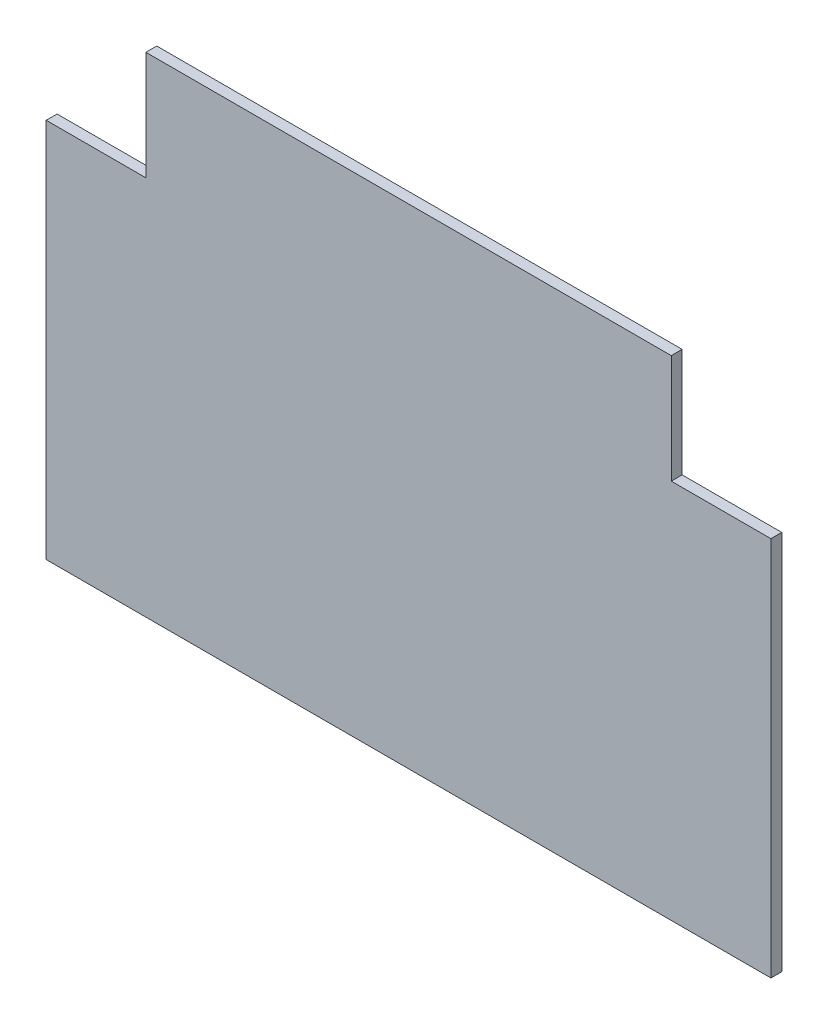
ISO-10303-21;
HEADER;
FILE_DESCRIPTION(('STEP AP214'),'2;1');
FILE_NAME('part.step','',(''),(''),'','','');
FILE_SCHEMA(('AUTOMOTIVE_DESIGN { 1 0 10303 214 1 1 1 1 }'));
ENDSEC;
DATA;
#1=APPLICATION_CONTEXT('core data for automotive mechanical design processes');
#2=APPLICATION_PROTOCOL_DEFINITION('international standard','automotive_design',2000,#1);
#3=PRODUCT_CONTEXT('',#1,'mechanical');
#4=PRODUCT('Part','Part','',(#3));
#5=PRODUCT_RELATED_PRODUCT_CATEGORY('part','',(#4));
#6=PRODUCT_DEFINITION_FORMATION('','',#4);
#7=PRODUCT_DEFINITION_CONTEXT('part definition',#1,'design');
#8=PRODUCT_DEFINITION('design','',#6,#7);
#9=PRODUCT_DEFINITION_SHAPE('','',#8);
#10=(LENGTH_UNIT() NAMED_UNIT(*) SI_UNIT(.MILLI.,.METRE.));
#11=(NAMED_UNIT(*) PLANE_ANGLE_UNIT() SI_UNIT($,.RADIAN.));
#12=(NAMED_UNIT(*) SI_UNIT($,.STERADIAN.) SOLID_ANGLE_UNIT());
#13=UNCERTAINTY_MEASURE_WITH_UNIT(LENGTH_MEASURE(1.E-05),#10,'distance_accuracy_value','');
#14=(GEOMETRIC_REPRESENTATION_CONTEXT(3) GLOBAL_UNCERTAINTY_ASSIGNED_CONTEXT((#13)) GLOBAL_UNIT_ASSIGNED_CONTEXT((#10,
#11,#12)) REPRESENTATION_CONTEXT('',''));
#15=CARTESIAN_POINT('',(0.,0.,0.));
#16=DIRECTION('',(0.,0.,1.));
#17=DIRECTION('',(1.,0.,0.));
#18=AXIS2_PLACEMENT_3D('',#15,#16,#17);
#19=CARTESIAN_POINT('',(-110.868616619322,260.666802075719,6.));
#20=DIRECTION('',(1.,0.,0.));
#21=DIRECTION('',(0.,1.,0.));
#22=AXIS2_PLACEMENT_3D('',#19,#20,#21);
#23=PLANE('',#22);
#24=DIRECTION('',(0.,-1.,0.));
#25=VECTOR('',#24,1.);
#26=CARTESIAN_POINT('',(-110.868616619322,260.666802075719,6.));
#27=LINE('',#26,#25);
#28=CARTESIAN_POINT('',(-110.868616619322,200.666802075719,6.));
#29=VERTEX_POINT('',#28);
#30=CARTESIAN_POINT('',(-110.868616619322,-9.33319792428152,6.));
#31=VERTEX_POINT('',#30);
#32=EDGE_CURVE('E140',#29,#31,#27,.T.);
#33=ORIENTED_EDGE('',*,*,#32,.F.);
#34=DIRECTION('',(0.,0.,-1.));
#35=VECTOR('',#34,1.);
#36=CARTESIAN_POINT('',(-110.868616619322,200.666802075719,40.));
#37=LINE('',#36,#35);
#38=CARTESIAN_POINT('',(-110.868616619322,200.666802075719,0.));
#39=VERTEX_POINT('',#38);
#40=EDGE_CURVE('E113',#29,#39,#37,.T.);
#41=ORIENTED_EDGE('',*,*,#40,.T.);
#42=DIRECTION('',(0.,-1.,0.));
#43=VECTOR('',#42,1.);
#44=CARTESIAN_POINT('',(-110.868616619322,260.666802075719,0.));
#45=LINE('',#44,#43);
#46=CARTESIAN_POINT('',(-110.868616619322,-9.33319792428152,0.));
#47=VERTEX_POINT('',#46);
#48=EDGE_CURVE('E139',#39,#47,#45,.T.);
#49=ORIENTED_EDGE('',*,*,#48,.T.);
#50=DIRECTION('',(0.,0.,-1.));
#51=VECTOR('',#50,1.);
#52=CARTESIAN_POINT('',(-110.868616619322,-9.33319792428152,6.));
#53=LINE('',#52,#51);
#54=EDGE_CURVE('E11',#31,#47,#53,.T.);
#55=ORIENTED_EDGE('',*,*,#54,.F.);
#56=EDGE_LOOP('',(#33,#41,#49,#55));
#57=FACE_BOUND('',#56,.T.);
#58=ADVANCED_FACE('F33',(#57),#23,.F.);
#59=CARTESIAN_POINT('',(-110.868616619322,-9.33319792428152,6.));
#60=DIRECTION('',(0.,1.,0.));
#61=DIRECTION('',(0.,0.,1.));
#62=AXIS2_PLACEMENT_3D('',#59,#60,#61);
#63=PLANE('',#62);
#64=DIRECTION('',(1.,0.,0.));
#65=VECTOR('',#64,1.);
#66=CARTESIAN_POINT('',(-110.868616619322,-9.33319792428152,0.));
#67=LINE('',#66,#65);
#68=CARTESIAN_POINT('',(289.131383380678,-9.33319792428152,0.));
#69=VERTEX_POINT('',#68);
#70=EDGE_CURVE('E151',#47,#69,#67,.T.);
#71=ORIENTED_EDGE('',*,*,#70,.T.);
#72=DIRECTION('',(0.,0.,-1.));
#73=VECTOR('',#72,1.);
#74=CARTESIAN_POINT('',(289.131383380678,-9.33319792428152,6.));
#75=LINE('',#74,#73);
#76=CARTESIAN_POINT('',(289.131383380678,-9.33319792428152,6.));
#77=VERTEX_POINT('',#76);
#78=EDGE_CURVE('E40',#77,#69,#75,.T.);
#79=ORIENTED_EDGE('',*,*,#78,.F.);
#80=DIRECTION('',(1.,0.,0.));
#81=VECTOR('',#80,1.);
#82=CARTESIAN_POINT('',(-110.868616619322,-9.33319792428152,6.));
#83=LINE('',#82,#81);
#84=EDGE_CURVE('E142',#31,#77,#83,.T.);
#85=ORIENTED_EDGE('',*,*,#84,.F.);
#86=ORIENTED_EDGE('',*,*,#54,.T.);
#87=EDGE_LOOP('',(#71,#79,#85,#86));
#88=FACE_BOUND('',#87,.T.);
#89=ADVANCED_FACE('F166',(#88),#63,.F.);
#90=CARTESIAN_POINT('',(289.131383380678,260.666802075719,6.));
#91=DIRECTION('',(-1.,0.,0.));
#92=DIRECTION('',(0.,-1.,0.));
#93=AXIS2_PLACEMENT_3D('',#90,#91,#92);
#94=PLANE('',#93);
#95=DIRECTION('',(0.,1.,0.));
#96=VECTOR('',#95,1.);
#97=CARTESIAN_POINT('',(289.131383380678,260.666802075719,0.));
#98=LINE('',#97,#96);
#99=CARTESIAN_POINT('',(289.131383380678,200.666802075719,0.));
#100=VERTEX_POINT('',#99);
#101=EDGE_CURVE('E153',#69,#100,#98,.T.);
#102=ORIENTED_EDGE('',*,*,#101,.T.);
#103=DIRECTION('',(0.,0.,-1.));
#104=VECTOR('',#103,1.);
#105=CARTESIAN_POINT('',(289.131383380678,200.666802075719,40.));
#106=LINE('',#105,#104);
#107=CARTESIAN_POINT('',(289.131383380678,200.666802075719,6.));
#108=VERTEX_POINT('',#107);
#109=EDGE_CURVE('E47',#108,#100,#106,.T.);
#110=ORIENTED_EDGE('',*,*,#109,.F.);
#111=DIRECTION('',(0.,1.,0.));
#112=VECTOR('',#111,1.);
#113=CARTESIAN_POINT('',(289.131383380678,260.666802075719,6.));
#114=LINE('',#113,#112);
#115=EDGE_CURVE('E144',#77,#108,#114,.T.);
#116=ORIENTED_EDGE('',*,*,#115,.F.);
#117=ORIENTED_EDGE('',*,*,#78,.T.);
#118=EDGE_LOOP('',(#102,#110,#116,#117));
#119=FACE_BOUND('',#118,.T.);
#120=ADVANCED_FACE('F159',(#119),#94,.F.);
#121=CARTESIAN_POINT('',(-110.868616619322,260.666802075719,6.));
#122=DIRECTION('',(0.,-1.,0.));
#123=DIRECTION('',(0.,0.,-1.));
#124=AXIS2_PLACEMENT_3D('',#121,#122,#123);
#125=PLANE('',#124);
#126=DIRECTION('',(-1.,0.,0.));
#127=VECTOR('',#126,1.);
#128=CARTESIAN_POINT('',(-110.868616619322,260.666802075719,6.));
#129=LINE('',#128,#127);
#130=CARTESIAN_POINT('',(234.131383380678,260.666802075719,6.));
#131=VERTEX_POINT('',#130);
#132=CARTESIAN_POINT('',(-55.8686166193218,260.666802075719,6.));
#133=VERTEX_POINT('',#132);
#134=EDGE_CURVE('E147',#131,#133,#129,.T.);
#135=ORIENTED_EDGE('',*,*,#134,.F.);
#136=DIRECTION('',(0.,0.,-1.));
#137=VECTOR('',#136,1.);
#138=CARTESIAN_POINT('',(234.131383380678,260.666802075719,40.));
#139=LINE('',#138,#137);
#140=CARTESIAN_POINT('',(234.131383380678,260.666802075719,0.));
#141=VERTEX_POINT('',#140);
#142=EDGE_CURVE('E106',#131,#141,#139,.T.);
#143=ORIENTED_EDGE('',*,*,#142,.T.);
#144=DIRECTION('',(-1.,0.,0.));
#145=VECTOR('',#144,1.);
#146=CARTESIAN_POINT('',(-110.868616619322,260.666802075719,0.));
#147=LINE('',#146,#145);
#148=CARTESIAN_POINT('',(-55.8686166193218,260.666802075719,0.));
#149=VERTEX_POINT('',#148);
#150=EDGE_CURVE('E118',#141,#149,#147,.T.);
#151=ORIENTED_EDGE('',*,*,#150,.T.);
#152=DIRECTION('',(0.,0.,-1.));
#153=VECTOR('',#152,1.);
#154=CARTESIAN_POINT('',(-55.8686166193218,260.666802075719,40.));
#155=LINE('',#154,#153);
#156=EDGE_CURVE('E55',#133,#149,#155,.T.);
#157=ORIENTED_EDGE('',*,*,#156,.F.);
#158=EDGE_LOOP('',(#135,#143,#151,#157));
#159=FACE_BOUND('',#158,.T.);
#160=ADVANCED_FACE('F179',(#159),#125,.F.);
#161=CARTESIAN_POINT('',(0.,0.,6.));
#162=DIRECTION('',(0.,0.,1.));
#163=DIRECTION('',(1.,0.,0.));
#164=AXIS2_PLACEMENT_3D('',#161,#162,#163);
#165=PLANE('',#164);
#166=DIRECTION('',(0.,-1.,0.));
#167=VECTOR('',#166,1.);
#168=CARTESIAN_POINT('',(234.131383380678,0.,6.));
#169=LINE('',#168,#167);
#170=CARTESIAN_POINT('',(234.131383380678,200.666802075719,6.));
#171=VERTEX_POINT('',#170);
#172=EDGE_CURVE('E104',#131,#171,#169,.T.);
#173=ORIENTED_EDGE('',*,*,#172,.F.);
#174=ORIENTED_EDGE('',*,*,#134,.T.);
#175=DIRECTION('',(0.,1.,0.));
#176=VECTOR('',#175,1.);
#177=CARTESIAN_POINT('',(-55.8686166193217,0.,6.));
#178=LINE('',#177,#176);
#179=CARTESIAN_POINT('',(-55.8686166193218,200.666802075719,6.));
#180=VERTEX_POINT('',#179);
#181=EDGE_CURVE('E122',#180,#133,#178,.T.);
#182=ORIENTED_EDGE('',*,*,#181,.F.);
#183=DIRECTION('',(1.,0.,0.));
#184=VECTOR('',#183,1.);
#185=CARTESIAN_POINT('',(0.,200.666802075719,6.));
#186=LINE('',#185,#184);
#187=EDGE_CURVE('E134',#29,#180,#186,.T.);
#188=ORIENTED_EDGE('',*,*,#187,.F.);
#189=ORIENTED_EDGE('',*,*,#32,.T.);
#190=ORIENTED_EDGE('',*,*,#84,.T.);
#191=ORIENTED_EDGE('',*,*,#115,.T.);
#192=DIRECTION('',(1.,0.,0.));
#193=VECTOR('',#192,1.);
#194=CARTESIAN_POINT('',(0.,200.666802075719,6.));
#195=LINE('',#194,#193);
#196=EDGE_CURVE('E136',#171,#108,#195,.T.);
#197=ORIENTED_EDGE('',*,*,#196,.F.);
#198=EDGE_LOOP('',(#173,#174,#182,#188,#189,#190,#191,#197));
#199=FACE_BOUND('',#198,.T.);
#200=ADVANCED_FACE('F175',(#199),#165,.T.);
#201=CARTESIAN_POINT('',(0.,0.,0.));
#202=DIRECTION('',(0.,0.,1.));
#203=DIRECTION('',(1.,0.,0.));
#204=AXIS2_PLACEMENT_3D('',#201,#202,#203);
#205=PLANE('',#204);
#206=ORIENTED_EDGE('',*,*,#150,.F.);
#207=DIRECTION('',(0.,1.,0.));
#208=VECTOR('',#207,1.);
#209=CARTESIAN_POINT('',(234.131383380678,200.666802075719,0.));
#210=LINE('',#209,#208);
#211=CARTESIAN_POINT('',(234.131383380678,200.666802075719,0.));
#212=VERTEX_POINT('',#211);
#213=EDGE_CURVE('E101',#212,#141,#210,.T.);
#214=ORIENTED_EDGE('',*,*,#213,.F.);
#215=DIRECTION('',(-1.,0.,0.));
#216=VECTOR('',#215,1.);
#217=CARTESIAN_POINT('',(289.131383380678,200.666802075719,0.));
#218=LINE('',#217,#216);
#219=EDGE_CURVE('E108',#100,#212,#218,.T.);
#220=ORIENTED_EDGE('',*,*,#219,.F.);
#221=ORIENTED_EDGE('',*,*,#101,.F.);
#222=ORIENTED_EDGE('',*,*,#70,.F.);
#223=ORIENTED_EDGE('',*,*,#48,.F.);
#224=DIRECTION('',(-1.,0.,0.));
#225=VECTOR('',#224,1.);
#226=CARTESIAN_POINT('',(-110.868616619322,200.666802075719,0.));
#227=LINE('',#226,#225);
#228=CARTESIAN_POINT('',(-55.8686166193218,200.666802075719,0.));
#229=VERTEX_POINT('',#228);
#230=EDGE_CURVE('E126',#229,#39,#227,.T.);
#231=ORIENTED_EDGE('',*,*,#230,.F.);
#232=DIRECTION('',(0.,-1.,0.));
#233=VECTOR('',#232,1.);
#234=CARTESIAN_POINT('',(-55.8686166193218,200.666802075719,0.));
#235=LINE('',#234,#233);
#236=EDGE_CURVE('E124',#149,#229,#235,.T.);
#237=ORIENTED_EDGE('',*,*,#236,.F.);
#238=EDGE_LOOP('',(#206,#214,#220,#221,#222,#223,#231,#237));
#239=FACE_BOUND('',#238,.T.);
#240=ADVANCED_FACE('F116',(#239),#205,.F.);
#241=CARTESIAN_POINT('',(-110.868616619322,200.666802075719,40.));
#242=DIRECTION('',(0.,-1.,0.));
#243=DIRECTION('',(0.,0.,-1.));
#244=AXIS2_PLACEMENT_3D('',#241,#242,#243);
#245=PLANE('',#244);
#246=ORIENTED_EDGE('',*,*,#187,.T.);
#247=DIRECTION('',(0.,0.,-1.));
#248=VECTOR('',#247,1.);
#249=CARTESIAN_POINT('',(-55.8686166193218,200.666802075719,40.));
#250=LINE('',#249,#248);
#251=EDGE_CURVE('E130',#180,#229,#250,.T.);
#252=ORIENTED_EDGE('',*,*,#251,.T.);
#253=ORIENTED_EDGE('',*,*,#230,.T.);
#254=ORIENTED_EDGE('',*,*,#40,.F.);
#255=EDGE_LOOP('',(#246,#252,#253,#254));
#256=FACE_BOUND('',#255,.T.);
#257=ADVANCED_FACE('F171',(#256),#245,.F.);
#258=CARTESIAN_POINT('',(-55.8686166193218,200.666802075719,40.));
#259=DIRECTION('',(1.,0.,0.));
#260=DIRECTION('',(0.,1.,0.));
#261=AXIS2_PLACEMENT_3D('',#258,#259,#260);
#262=PLANE('',#261);
#263=ORIENTED_EDGE('',*,*,#181,.T.);
#264=ORIENTED_EDGE('',*,*,#156,.T.);
#265=ORIENTED_EDGE('',*,*,#236,.T.);
#266=ORIENTED_EDGE('',*,*,#251,.F.);
#267=EDGE_LOOP('',(#263,#264,#265,#266));
#268=FACE_BOUND('',#267,.T.);
#269=ADVANCED_FACE('F177',(#268),#262,.F.);
#270=CARTESIAN_POINT('',(234.131383380678,200.666802075719,40.));
#271=DIRECTION('',(-1.,0.,0.));
#272=DIRECTION('',(0.,0.,1.));
#273=AXIS2_PLACEMENT_3D('',#270,#271,#272);
#274=PLANE('',#273);
#275=ORIENTED_EDGE('',*,*,#172,.T.);
#276=DIRECTION('',(0.,0.,-1.));
#277=VECTOR('',#276,1.);
#278=CARTESIAN_POINT('',(234.131383380678,200.666802075719,40.));
#279=LINE('',#278,#277);
#280=EDGE_CURVE('E98',#171,#212,#279,.T.);
#281=ORIENTED_EDGE('',*,*,#280,.T.);
#282=ORIENTED_EDGE('',*,*,#213,.T.);
#283=ORIENTED_EDGE('',*,*,#142,.F.);
#284=EDGE_LOOP('',(#275,#281,#282,#283));
#285=FACE_BOUND('',#284,.T.);
#286=ADVANCED_FACE('F99',(#285),#274,.F.);
#287=CARTESIAN_POINT('',(289.131383380678,200.666802075719,40.));
#288=DIRECTION('',(0.,-1.,0.));
#289=DIRECTION('',(0.,0.,-1.));
#290=AXIS2_PLACEMENT_3D('',#287,#288,#289);
#291=PLANE('',#290);
#292=ORIENTED_EDGE('',*,*,#196,.T.);
#293=ORIENTED_EDGE('',*,*,#109,.T.);
#294=ORIENTED_EDGE('',*,*,#219,.T.);
#295=ORIENTED_EDGE('',*,*,#280,.F.);
#296=EDGE_LOOP('',(#292,#293,#294,#295));
#297=FACE_BOUND('',#296,.T.);
#298=ADVANCED_FACE('F109',(#297),#291,.F.);
#299=CLOSED_SHELL('',(#58,#89,#120,#160,#200,#240,#257,#269,#286,#298));
#300=MANIFOLD_SOLID_BREP('B2',#299);
#301=ADVANCED_BREP_SHAPE_REPRESENTATION('',(#18,#300),#14);
#302=SHAPE_DEFINITION_REPRESENTATION(#9,#301);
ENDSEC;
END-ISO-10303-21;
